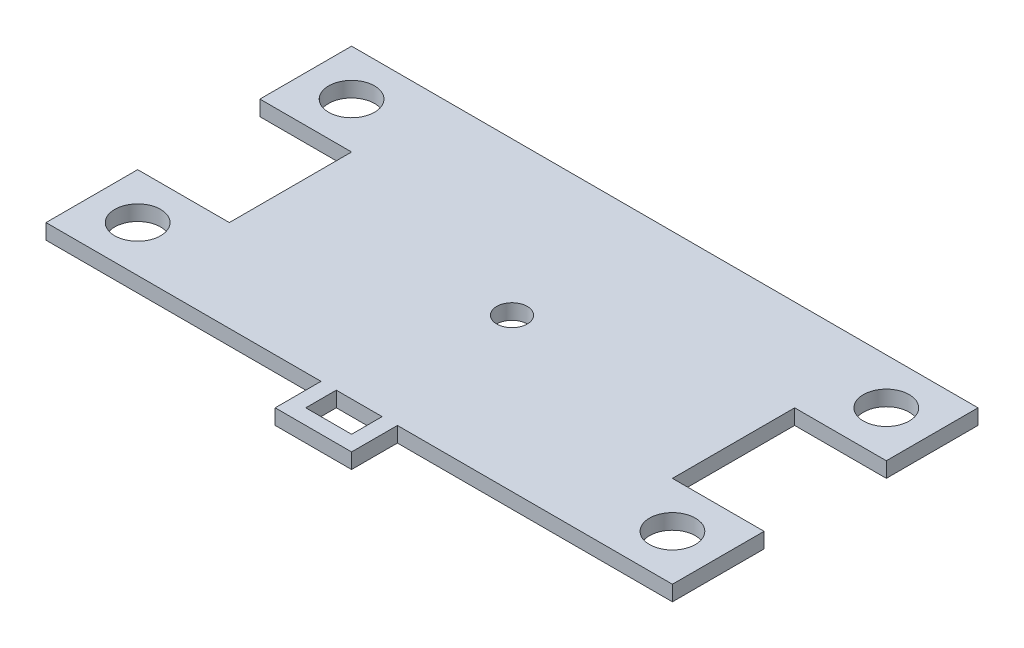
ISO-10303-21;
HEADER;
FILE_DESCRIPTION(('STEP AP214'),'2;1');
FILE_NAME('part.step','',(''),(''),'','','');
FILE_SCHEMA(('AUTOMOTIVE_DESIGN { 1 0 10303 214 1 1 1 1 }'));
ENDSEC;
DATA;
#1=APPLICATION_CONTEXT('core data for automotive mechanical design processes');
#2=APPLICATION_PROTOCOL_DEFINITION('international standard','automotive_design',2000,#1);
#3=PRODUCT_CONTEXT('',#1,'mechanical');
#4=PRODUCT('Part','Part','',(#3));
#5=PRODUCT_RELATED_PRODUCT_CATEGORY('part','',(#4));
#6=PRODUCT_DEFINITION_FORMATION('','',#4);
#7=PRODUCT_DEFINITION_CONTEXT('part definition',#1,'design');
#8=PRODUCT_DEFINITION('design','',#6,#7);
#9=PRODUCT_DEFINITION_SHAPE('','',#8);
#10=(LENGTH_UNIT() NAMED_UNIT(*) SI_UNIT(.MILLI.,.METRE.));
#11=(NAMED_UNIT(*) PLANE_ANGLE_UNIT() SI_UNIT($,.RADIAN.));
#12=(NAMED_UNIT(*) SI_UNIT($,.STERADIAN.) SOLID_ANGLE_UNIT());
#13=UNCERTAINTY_MEASURE_WITH_UNIT(LENGTH_MEASURE(1.E-05),#10,'distance_accuracy_value','');
#14=(GEOMETRIC_REPRESENTATION_CONTEXT(3) GLOBAL_UNCERTAINTY_ASSIGNED_CONTEXT((#13)) GLOBAL_UNIT_ASSIGNED_CONTEXT((#10,
#11,#12)) REPRESENTATION_CONTEXT('',''));
#15=CARTESIAN_POINT('',(0.,0.,0.));
#16=DIRECTION('',(0.,0.,1.));
#17=DIRECTION('',(1.,0.,0.));
#18=AXIS2_PLACEMENT_3D('',#15,#16,#17);
#19=CARTESIAN_POINT('',(0.,1.,0.));
#20=DIRECTION('',(0.,1.,0.));
#21=DIRECTION('',(0.,0.,1.));
#22=AXIS2_PLACEMENT_3D('',#19,#20,#21);
#23=PLANE('',#22);
#24=CARTESIAN_POINT('',(35.,1.,-14.));
#25=DIRECTION('',(0.,1.,0.));
#26=DIRECTION('',(0.,0.,1.));
#27=AXIS2_PLACEMENT_3D('',#24,#25,#26);
#28=CIRCLE('',#27,1.5);
#29=CARTESIAN_POINT('',(35.,1.,-12.5));
#30=VERTEX_POINT('',#29);
#31=EDGE_CURVE('E211',#30,#30,#28,.T.);
#32=ORIENTED_EDGE('',*,*,#31,.F.);
#33=EDGE_LOOP('',(#32));
#34=FACE_BOUND('',#33,.T.);
#35=CARTESIAN_POINT('',(0.,1.,0.));
#36=DIRECTION('',(0.,1.,0.));
#37=DIRECTION('',(0.,0.,1.));
#38=AXIS2_PLACEMENT_3D('',#35,#36,#37);
#39=CIRCLE('',#38,1.5);
#40=CARTESIAN_POINT('',(0.,1.,1.5));
#41=VERTEX_POINT('',#40);
#42=EDGE_CURVE('E223',#41,#41,#39,.T.);
#43=ORIENTED_EDGE('',*,*,#42,.F.);
#44=EDGE_LOOP('',(#43));
#45=FACE_BOUND('',#44,.T.);
#46=DIRECTION('',(0.,0.,1.));
#47=VECTOR('',#46,1.);
#48=CARTESIAN_POINT('',(-3.,1.,-17.));
#49=LINE('',#48,#47);
#50=CARTESIAN_POINT('',(-3.,1.,-17.));
#51=VERTEX_POINT('',#50);
#52=CARTESIAN_POINT('',(-3.,1.,-11.));
#53=VERTEX_POINT('',#52);
#54=EDGE_CURVE('E235',#51,#53,#49,.T.);
#55=ORIENTED_EDGE('',*,*,#54,.T.);
#56=DIRECTION('',(1.,0.,0.));
#57=VECTOR('',#56,1.);
#58=CARTESIAN_POINT('',(-3.,1.,-11.));
#59=LINE('',#58,#57);
#60=CARTESIAN_POINT('',(3.,1.,-11.));
#61=VERTEX_POINT('',#60);
#62=EDGE_CURVE('E238',#53,#61,#59,.T.);
#63=ORIENTED_EDGE('',*,*,#62,.T.);
#64=DIRECTION('',(0.,0.,1.));
#65=VECTOR('',#64,1.);
#66=CARTESIAN_POINT('',(3.,1.,-11.));
#67=LINE('',#66,#65);
#68=CARTESIAN_POINT('',(3.,1.,-3.));
#69=VERTEX_POINT('',#68);
#70=EDGE_CURVE('E241',#61,#69,#67,.T.);
#71=ORIENTED_EDGE('',*,*,#70,.T.);
#72=DIRECTION('',(-1.,0.,0.));
#73=VECTOR('',#72,1.);
#74=CARTESIAN_POINT('',(3.,1.,-3.));
#75=LINE('',#74,#73);
#76=CARTESIAN_POINT('',(-3.,1.,-3.));
#77=VERTEX_POINT('',#76);
#78=EDGE_CURVE('E243',#69,#77,#75,.T.);
#79=ORIENTED_EDGE('',*,*,#78,.T.);
#80=DIRECTION('',(0.,0.,1.));
#81=VECTOR('',#80,1.);
#82=CARTESIAN_POINT('',(-3.,1.,-3.));
#83=LINE('',#82,#81);
#84=CARTESIAN_POINT('',(-3.,1.,3.));
#85=VERTEX_POINT('',#84);
#86=EDGE_CURVE('E245',#77,#85,#83,.T.);
#87=ORIENTED_EDGE('',*,*,#86,.T.);
#88=DIRECTION('',(1.,0.,0.));
#89=VECTOR('',#88,1.);
#90=CARTESIAN_POINT('',(-3.,1.,3.));
#91=LINE('',#90,#89);
#92=CARTESIAN_POINT('',(15.,1.,3.));
#93=VERTEX_POINT('',#92);
#94=EDGE_CURVE('E247',#85,#93,#91,.T.);
#95=ORIENTED_EDGE('',*,*,#94,.T.);
#96=DIRECTION('',(0.,0.,1.));
#97=VECTOR('',#96,1.);
#98=CARTESIAN_POINT('',(15.,1.,3.));
#99=LINE('',#98,#97);
#100=CARTESIAN_POINT('',(15.,1.,6.));
#101=VERTEX_POINT('',#100);
#102=EDGE_CURVE('E249',#93,#101,#99,.T.);
#103=ORIENTED_EDGE('',*,*,#102,.T.);
#104=DIRECTION('',(1.,0.,0.));
#105=VECTOR('',#104,1.);
#106=CARTESIAN_POINT('',(15.,1.,6.));
#107=LINE('',#106,#105);
#108=CARTESIAN_POINT('',(20.,1.,5.99999999999999));
#109=VERTEX_POINT('',#108);
#110=EDGE_CURVE('E251',#101,#109,#107,.T.);
#111=ORIENTED_EDGE('',*,*,#110,.T.);
#112=DIRECTION('',(0.,0.,-1.));
#113=VECTOR('',#112,1.);
#114=CARTESIAN_POINT('',(20.,1.,3.));
#115=LINE('',#114,#113);
#116=CARTESIAN_POINT('',(20.,1.,3.));
#117=VERTEX_POINT('',#116);
#118=EDGE_CURVE('E253',#109,#117,#115,.T.);
#119=ORIENTED_EDGE('',*,*,#118,.T.);
#120=DIRECTION('',(1.,0.,0.));
#121=VECTOR('',#120,1.);
#122=CARTESIAN_POINT('',(20.,1.,3.));
#123=LINE('',#122,#121);
#124=CARTESIAN_POINT('',(38.,1.,3.00000000000001));
#125=VERTEX_POINT('',#124);
#126=EDGE_CURVE('E255',#117,#125,#123,.T.);
#127=ORIENTED_EDGE('',*,*,#126,.T.);
#128=DIRECTION('',(0.,0.,-1.));
#129=VECTOR('',#128,1.);
#130=CARTESIAN_POINT('',(38.,1.,-3.));
#131=LINE('',#130,#129);
#132=CARTESIAN_POINT('',(38.,1.,-3.));
#133=VERTEX_POINT('',#132);
#134=EDGE_CURVE('E257',#125,#133,#131,.T.);
#135=ORIENTED_EDGE('',*,*,#134,.T.);
#136=DIRECTION('',(-1.,0.,0.));
#137=VECTOR('',#136,1.);
#138=CARTESIAN_POINT('',(32.,1.,-3.));
#139=LINE('',#138,#137);
#140=CARTESIAN_POINT('',(32.,1.,-3.));
#141=VERTEX_POINT('',#140);
#142=EDGE_CURVE('E259',#133,#141,#139,.T.);
#143=ORIENTED_EDGE('',*,*,#142,.T.);
#144=DIRECTION('',(0.,0.,-1.));
#145=VECTOR('',#144,1.);
#146=CARTESIAN_POINT('',(32.,1.,-11.));
#147=LINE('',#146,#145);
#148=CARTESIAN_POINT('',(32.,1.,-11.));
#149=VERTEX_POINT('',#148);
#150=EDGE_CURVE('E261',#141,#149,#147,.T.);
#151=ORIENTED_EDGE('',*,*,#150,.T.);
#152=DIRECTION('',(1.,0.,0.));
#153=VECTOR('',#152,1.);
#154=CARTESIAN_POINT('',(38.,1.,-11.));
#155=LINE('',#154,#153);
#156=CARTESIAN_POINT('',(38.,1.,-11.));
#157=VERTEX_POINT('',#156);
#158=EDGE_CURVE('E263',#149,#157,#155,.T.);
#159=ORIENTED_EDGE('',*,*,#158,.T.);
#160=DIRECTION('',(0.,0.,-1.));
#161=VECTOR('',#160,1.);
#162=CARTESIAN_POINT('',(38.,1.,-17.));
#163=LINE('',#162,#161);
#164=CARTESIAN_POINT('',(38.,1.,-17.));
#165=VERTEX_POINT('',#164);
#166=EDGE_CURVE('E265',#157,#165,#163,.T.);
#167=ORIENTED_EDGE('',*,*,#166,.T.);
#168=DIRECTION('',(-1.,0.,0.));
#169=VECTOR('',#168,1.);
#170=CARTESIAN_POINT('',(38.,1.,-17.));
#171=LINE('',#170,#169);
#172=EDGE_CURVE('E267',#165,#51,#171,.T.);
#173=ORIENTED_EDGE('',*,*,#172,.T.);
#174=EDGE_LOOP('',(#55,#63,#71,#79,#87,#95,#103,#111,#119,#127,#135,#143,#151,#159,#167,#173));
#175=FACE_BOUND('',#174,.T.);
#176=CARTESIAN_POINT('',(0.,1.,-14.));
#177=DIRECTION('',(0.,1.,0.));
#178=DIRECTION('',(0.,0.,1.));
#179=AXIS2_PLACEMENT_3D('',#176,#177,#178);
#180=CIRCLE('',#179,1.5);
#181=CARTESIAN_POINT('',(0.,1.,-12.5));
#182=VERTEX_POINT('',#181);
#183=EDGE_CURVE('E229',#182,#182,#180,.T.);
#184=ORIENTED_EDGE('',*,*,#183,.F.);
#185=EDGE_LOOP('',(#184));
#186=FACE_BOUND('',#185,.T.);
#187=CARTESIAN_POINT('',(35.,1.,0.));
#188=DIRECTION('',(0.,1.,0.));
#189=DIRECTION('',(0.,0.,1.));
#190=AXIS2_PLACEMENT_3D('',#187,#188,#189);
#191=CIRCLE('',#190,1.5);
#192=CARTESIAN_POINT('',(35.,1.,1.5));
#193=VERTEX_POINT('',#192);
#194=EDGE_CURVE('E217',#193,#193,#191,.T.);
#195=ORIENTED_EDGE('',*,*,#194,.F.);
#196=EDGE_LOOP('',(#195));
#197=FACE_BOUND('',#196,.T.);
#198=CARTESIAN_POINT('',(17.5,1.,-7.));
#199=DIRECTION('',(0.,1.,0.));
#200=DIRECTION('',(0.,0.,1.));
#201=AXIS2_PLACEMENT_3D('',#198,#199,#200);
#202=CIRCLE('',#201,1.);
#203=CARTESIAN_POINT('',(17.5,1.,-6.));
#204=VERTEX_POINT('',#203);
#205=EDGE_CURVE('E205',#204,#204,#202,.T.);
#206=ORIENTED_EDGE('',*,*,#205,.F.);
#207=EDGE_LOOP('',(#206));
#208=FACE_BOUND('',#207,.T.);
#209=DIRECTION('',(0.,0.,1.));
#210=VECTOR('',#209,1.);
#211=CARTESIAN_POINT('',(16.,1.,3.));
#212=LINE('',#211,#210);
#213=CARTESIAN_POINT('',(16.,1.,3.));
#214=VERTEX_POINT('',#213);
#215=CARTESIAN_POINT('',(16.,1.,5.));
#216=VERTEX_POINT('',#215);
#217=EDGE_CURVE('E177',#214,#216,#212,.T.);
#218=ORIENTED_EDGE('',*,*,#217,.F.);
#219=DIRECTION('',(-1.,0.,0.));
#220=VECTOR('',#219,1.);
#221=CARTESIAN_POINT('',(16.,1.,3.));
#222=LINE('',#221,#220);
#223=CARTESIAN_POINT('',(19.,1.,3.));
#224=VERTEX_POINT('',#223);
#225=EDGE_CURVE('E169',#224,#214,#222,.T.);
#226=ORIENTED_EDGE('',*,*,#225,.F.);
#227=DIRECTION('',(0.,0.,-1.));
#228=VECTOR('',#227,1.);
#229=CARTESIAN_POINT('',(19.,1.,3.));
#230=LINE('',#229,#228);
#231=CARTESIAN_POINT('',(19.,1.,5.));
#232=VERTEX_POINT('',#231);
#233=EDGE_CURVE('E191',#232,#224,#230,.T.);
#234=ORIENTED_EDGE('',*,*,#233,.F.);
#235=DIRECTION('',(1.,0.,0.));
#236=VECTOR('',#235,1.);
#237=CARTESIAN_POINT('',(16.,1.,5.));
#238=LINE('',#237,#236);
#239=EDGE_CURVE('E189',#216,#232,#238,.T.);
#240=ORIENTED_EDGE('',*,*,#239,.F.);
#241=EDGE_LOOP('',(#218,#226,#234,#240));
#242=FACE_BOUND('',#241,.T.);
#243=ADVANCED_FACE('F32',(#34,#45,#175,#186,#197,#208,#242),#23,.T.);
#244=CARTESIAN_POINT('',(0.,0.,0.));
#245=DIRECTION('',(0.,1.,0.));
#246=DIRECTION('',(0.,0.,1.));
#247=AXIS2_PLACEMENT_3D('',#244,#245,#246);
#248=PLANE('',#247);
#249=CARTESIAN_POINT('',(17.5,0.,-7.));
#250=DIRECTION('',(0.,1.,0.));
#251=DIRECTION('',(0.,0.,1.));
#252=AXIS2_PLACEMENT_3D('',#249,#250,#251);
#253=CIRCLE('',#252,1.);
#254=CARTESIAN_POINT('',(17.5,0.,-6.));
#255=VERTEX_POINT('',#254);
#256=EDGE_CURVE('E185',#255,#255,#253,.T.);
#257=ORIENTED_EDGE('',*,*,#256,.T.);
#258=EDGE_LOOP('',(#257));
#259=FACE_BOUND('',#258,.T.);
#260=CARTESIAN_POINT('',(35.,0.,-14.));
#261=DIRECTION('',(0.,1.,0.));
#262=DIRECTION('',(0.,0.,1.));
#263=AXIS2_PLACEMENT_3D('',#260,#261,#262);
#264=CIRCLE('',#263,1.5);
#265=CARTESIAN_POINT('',(35.,0.,-12.5));
#266=VERTEX_POINT('',#265);
#267=EDGE_CURVE('E208',#266,#266,#264,.T.);
#268=ORIENTED_EDGE('',*,*,#267,.T.);
#269=EDGE_LOOP('',(#268));
#270=FACE_BOUND('',#269,.T.);
#271=CARTESIAN_POINT('',(35.,0.,0.));
#272=DIRECTION('',(0.,1.,0.));
#273=DIRECTION('',(0.,0.,1.));
#274=AXIS2_PLACEMENT_3D('',#271,#272,#273);
#275=CIRCLE('',#274,1.5);
#276=CARTESIAN_POINT('',(35.,0.,1.5));
#277=VERTEX_POINT('',#276);
#278=EDGE_CURVE('E214',#277,#277,#275,.T.);
#279=ORIENTED_EDGE('',*,*,#278,.T.);
#280=EDGE_LOOP('',(#279));
#281=FACE_BOUND('',#280,.T.);
#282=CARTESIAN_POINT('',(0.,0.,0.));
#283=DIRECTION('',(0.,1.,0.));
#284=DIRECTION('',(0.,0.,1.));
#285=AXIS2_PLACEMENT_3D('',#282,#283,#284);
#286=CIRCLE('',#285,1.5);
#287=CARTESIAN_POINT('',(0.,0.,1.5));
#288=VERTEX_POINT('',#287);
#289=EDGE_CURVE('E220',#288,#288,#286,.T.);
#290=ORIENTED_EDGE('',*,*,#289,.T.);
#291=EDGE_LOOP('',(#290));
#292=FACE_BOUND('',#291,.T.);
#293=CARTESIAN_POINT('',(0.,0.,-14.));
#294=DIRECTION('',(0.,1.,0.));
#295=DIRECTION('',(0.,0.,1.));
#296=AXIS2_PLACEMENT_3D('',#293,#294,#295);
#297=CIRCLE('',#296,1.5);
#298=CARTESIAN_POINT('',(0.,0.,-12.5));
#299=VERTEX_POINT('',#298);
#300=EDGE_CURVE('E226',#299,#299,#297,.T.);
#301=ORIENTED_EDGE('',*,*,#300,.T.);
#302=EDGE_LOOP('',(#301));
#303=FACE_BOUND('',#302,.T.);
#304=DIRECTION('',(0.,0.,1.));
#305=VECTOR('',#304,1.);
#306=CARTESIAN_POINT('',(-3.,0.,-17.));
#307=LINE('',#306,#305);
#308=CARTESIAN_POINT('',(-3.,0.,-17.));
#309=VERTEX_POINT('',#308);
#310=CARTESIAN_POINT('',(-3.,0.,-11.));
#311=VERTEX_POINT('',#310);
#312=EDGE_CURVE('E232',#309,#311,#307,.T.);
#313=ORIENTED_EDGE('',*,*,#312,.F.);
#314=DIRECTION('',(-1.,0.,0.));
#315=VECTOR('',#314,1.);
#316=CARTESIAN_POINT('',(38.,0.,-17.));
#317=LINE('',#316,#315);
#318=CARTESIAN_POINT('',(38.,0.,-17.));
#319=VERTEX_POINT('',#318);
#320=EDGE_CURVE('E239',#319,#309,#317,.T.);
#321=ORIENTED_EDGE('',*,*,#320,.F.);
#322=DIRECTION('',(0.,0.,-1.));
#323=VECTOR('',#322,1.);
#324=CARTESIAN_POINT('',(38.,0.,-17.));
#325=LINE('',#324,#323);
#326=CARTESIAN_POINT('',(38.,0.,-11.));
#327=VERTEX_POINT('',#326);
#328=EDGE_CURVE('E298',#327,#319,#325,.T.);
#329=ORIENTED_EDGE('',*,*,#328,.F.);
#330=DIRECTION('',(1.,0.,0.));
#331=VECTOR('',#330,1.);
#332=CARTESIAN_POINT('',(38.,0.,-11.));
#333=LINE('',#332,#331);
#334=CARTESIAN_POINT('',(32.,0.,-11.));
#335=VERTEX_POINT('',#334);
#336=EDGE_CURVE('E296',#335,#327,#333,.T.);
#337=ORIENTED_EDGE('',*,*,#336,.F.);
#338=DIRECTION('',(0.,0.,-1.));
#339=VECTOR('',#338,1.);
#340=CARTESIAN_POINT('',(32.,0.,-11.));
#341=LINE('',#340,#339);
#342=CARTESIAN_POINT('',(32.,0.,-3.));
#343=VERTEX_POINT('',#342);
#344=EDGE_CURVE('E294',#343,#335,#341,.T.);
#345=ORIENTED_EDGE('',*,*,#344,.F.);
#346=DIRECTION('',(-1.,0.,0.));
#347=VECTOR('',#346,1.);
#348=CARTESIAN_POINT('',(32.,0.,-3.));
#349=LINE('',#348,#347);
#350=CARTESIAN_POINT('',(38.,0.,-3.));
#351=VERTEX_POINT('',#350);
#352=EDGE_CURVE('E292',#351,#343,#349,.T.);
#353=ORIENTED_EDGE('',*,*,#352,.F.);
#354=DIRECTION('',(0.,0.,-1.));
#355=VECTOR('',#354,1.);
#356=CARTESIAN_POINT('',(38.,0.,-3.));
#357=LINE('',#356,#355);
#358=CARTESIAN_POINT('',(38.,0.,3.00000000000001));
#359=VERTEX_POINT('',#358);
#360=EDGE_CURVE('E290',#359,#351,#357,.T.);
#361=ORIENTED_EDGE('',*,*,#360,.F.);
#362=DIRECTION('',(1.,0.,0.));
#363=VECTOR('',#362,1.);
#364=CARTESIAN_POINT('',(20.,0.,3.));
#365=LINE('',#364,#363);
#366=CARTESIAN_POINT('',(20.,0.,3.));
#367=VERTEX_POINT('',#366);
#368=EDGE_CURVE('E288',#367,#359,#365,.T.);
#369=ORIENTED_EDGE('',*,*,#368,.F.);
#370=DIRECTION('',(0.,0.,-1.));
#371=VECTOR('',#370,1.);
#372=CARTESIAN_POINT('',(20.,0.,3.));
#373=LINE('',#372,#371);
#374=CARTESIAN_POINT('',(20.,0.,5.99999999999999));
#375=VERTEX_POINT('',#374);
#376=EDGE_CURVE('E286',#375,#367,#373,.T.);
#377=ORIENTED_EDGE('',*,*,#376,.F.);
#378=DIRECTION('',(1.,0.,0.));
#379=VECTOR('',#378,1.);
#380=CARTESIAN_POINT('',(15.,0.,6.));
#381=LINE('',#380,#379);
#382=CARTESIAN_POINT('',(15.,0.,6.));
#383=VERTEX_POINT('',#382);
#384=EDGE_CURVE('E284',#383,#375,#381,.T.);
#385=ORIENTED_EDGE('',*,*,#384,.F.);
#386=DIRECTION('',(0.,0.,1.));
#387=VECTOR('',#386,1.);
#388=CARTESIAN_POINT('',(15.,0.,3.));
#389=LINE('',#388,#387);
#390=CARTESIAN_POINT('',(15.,0.,3.));
#391=VERTEX_POINT('',#390);
#392=EDGE_CURVE('E282',#391,#383,#389,.T.);
#393=ORIENTED_EDGE('',*,*,#392,.F.);
#394=DIRECTION('',(1.,0.,0.));
#395=VECTOR('',#394,1.);
#396=CARTESIAN_POINT('',(-3.,0.,3.));
#397=LINE('',#396,#395);
#398=CARTESIAN_POINT('',(-3.,0.,3.));
#399=VERTEX_POINT('',#398);
#400=EDGE_CURVE('E280',#399,#391,#397,.T.);
#401=ORIENTED_EDGE('',*,*,#400,.F.);
#402=DIRECTION('',(0.,0.,1.));
#403=VECTOR('',#402,1.);
#404=CARTESIAN_POINT('',(-3.,0.,-3.));
#405=LINE('',#404,#403);
#406=CARTESIAN_POINT('',(-3.,0.,-3.));
#407=VERTEX_POINT('',#406);
#408=EDGE_CURVE('E278',#407,#399,#405,.T.);
#409=ORIENTED_EDGE('',*,*,#408,.F.);
#410=DIRECTION('',(-1.,0.,0.));
#411=VECTOR('',#410,1.);
#412=CARTESIAN_POINT('',(3.,0.,-3.));
#413=LINE('',#412,#411);
#414=CARTESIAN_POINT('',(3.,0.,-3.));
#415=VERTEX_POINT('',#414);
#416=EDGE_CURVE('E276',#415,#407,#413,.T.);
#417=ORIENTED_EDGE('',*,*,#416,.F.);
#418=DIRECTION('',(0.,0.,1.));
#419=VECTOR('',#418,1.);
#420=CARTESIAN_POINT('',(3.,0.,-11.));
#421=LINE('',#420,#419);
#422=CARTESIAN_POINT('',(3.,0.,-11.));
#423=VERTEX_POINT('',#422);
#424=EDGE_CURVE('E274',#423,#415,#421,.T.);
#425=ORIENTED_EDGE('',*,*,#424,.F.);
#426=DIRECTION('',(1.,0.,0.));
#427=VECTOR('',#426,1.);
#428=CARTESIAN_POINT('',(-3.,0.,-11.));
#429=LINE('',#428,#427);
#430=EDGE_CURVE('E272',#311,#423,#429,.T.);
#431=ORIENTED_EDGE('',*,*,#430,.F.);
#432=EDGE_LOOP('',(#313,#321,#329,#337,#345,#353,#361,#369,#377,#385,#393,#401,#409,#417,#425,#431));
#433=FACE_BOUND('',#432,.T.);
#434=DIRECTION('',(-1.,0.,0.));
#435=VECTOR('',#434,1.);
#436=CARTESIAN_POINT('',(16.,0.,3.));
#437=LINE('',#436,#435);
#438=CARTESIAN_POINT('',(19.,0.,3.));
#439=VERTEX_POINT('',#438);
#440=CARTESIAN_POINT('',(16.,0.,3.));
#441=VERTEX_POINT('',#440);
#442=EDGE_CURVE('E55',#439,#441,#437,.T.);
#443=ORIENTED_EDGE('',*,*,#442,.T.);
#444=DIRECTION('',(0.,0.,1.));
#445=VECTOR('',#444,1.);
#446=CARTESIAN_POINT('',(16.,0.,3.));
#447=LINE('',#446,#445);
#448=CARTESIAN_POINT('',(16.,0.,5.));
#449=VERTEX_POINT('',#448);
#450=EDGE_CURVE('E184',#441,#449,#447,.T.);
#451=ORIENTED_EDGE('',*,*,#450,.T.);
#452=DIRECTION('',(1.,0.,0.));
#453=VECTOR('',#452,1.);
#454=CARTESIAN_POINT('',(16.,0.,5.));
#455=LINE('',#454,#453);
#456=CARTESIAN_POINT('',(19.,0.,5.));
#457=VERTEX_POINT('',#456);
#458=EDGE_CURVE('E197',#449,#457,#455,.T.);
#459=ORIENTED_EDGE('',*,*,#458,.T.);
#460=DIRECTION('',(0.,0.,-1.));
#461=VECTOR('',#460,1.);
#462=CARTESIAN_POINT('',(19.,0.,3.));
#463=LINE('',#462,#461);
#464=EDGE_CURVE('E178',#457,#439,#463,.T.);
#465=ORIENTED_EDGE('',*,*,#464,.T.);
#466=EDGE_LOOP('',(#443,#451,#459,#465));
#467=FACE_BOUND('',#466,.T.);
#468=ADVANCED_FACE('F352',(#259,#270,#281,#292,#303,#433,#467),#248,.F.);
#469=CARTESIAN_POINT('',(-3.,1.,-17.));
#470=DIRECTION('',(1.,0.,0.));
#471=DIRECTION('',(0.,0.,-1.));
#472=AXIS2_PLACEMENT_3D('',#469,#470,#471);
#473=PLANE('',#472);
#474=ORIENTED_EDGE('',*,*,#312,.T.);
#475=DIRECTION('',(0.,-1.,0.));
#476=VECTOR('',#475,1.);
#477=CARTESIAN_POINT('',(-3.,1.,-11.));
#478=LINE('',#477,#476);
#479=EDGE_CURVE('E11',#53,#311,#478,.T.);
#480=ORIENTED_EDGE('',*,*,#479,.F.);
#481=ORIENTED_EDGE('',*,*,#54,.F.);
#482=DIRECTION('',(0.,-1.,0.));
#483=VECTOR('',#482,1.);
#484=CARTESIAN_POINT('',(-3.,1.,-17.));
#485=LINE('',#484,#483);
#486=EDGE_CURVE('E269',#51,#309,#485,.T.);
#487=ORIENTED_EDGE('',*,*,#486,.T.);
#488=EDGE_LOOP('',(#474,#480,#481,#487));
#489=FACE_BOUND('',#488,.T.);
#490=ADVANCED_FACE('F34',(#489),#473,.F.);
#491=CARTESIAN_POINT('',(-3.,1.,-11.));
#492=DIRECTION('',(0.,0.,-1.));
#493=DIRECTION('',(-1.,0.,0.));
#494=AXIS2_PLACEMENT_3D('',#491,#492,#493);
#495=PLANE('',#494);
#496=ORIENTED_EDGE('',*,*,#430,.T.);
#497=DIRECTION('',(0.,-1.,0.));
#498=VECTOR('',#497,1.);
#499=CARTESIAN_POINT('',(3.,1.,-11.));
#500=LINE('',#499,#498);
#501=EDGE_CURVE('E40',#61,#423,#500,.T.);
#502=ORIENTED_EDGE('',*,*,#501,.F.);
#503=ORIENTED_EDGE('',*,*,#62,.F.);
#504=ORIENTED_EDGE('',*,*,#479,.T.);
#505=EDGE_LOOP('',(#496,#502,#503,#504));
#506=FACE_BOUND('',#505,.T.);
#507=ADVANCED_FACE('F370',(#506),#495,.F.);
#508=CARTESIAN_POINT('',(3.,1.,-11.));
#509=DIRECTION('',(1.,0.,0.));
#510=DIRECTION('',(0.,0.,-1.));
#511=AXIS2_PLACEMENT_3D('',#508,#509,#510);
#512=PLANE('',#511);
#513=ORIENTED_EDGE('',*,*,#424,.T.);
#514=DIRECTION('',(0.,-1.,0.));
#515=VECTOR('',#514,1.);
#516=CARTESIAN_POINT('',(3.,1.,-3.));
#517=LINE('',#516,#515);
#518=EDGE_CURVE('E339',#69,#415,#517,.T.);
#519=ORIENTED_EDGE('',*,*,#518,.F.);
#520=ORIENTED_EDGE('',*,*,#70,.F.);
#521=ORIENTED_EDGE('',*,*,#501,.T.);
#522=EDGE_LOOP('',(#513,#519,#520,#521));
#523=FACE_BOUND('',#522,.T.);
#524=ADVANCED_FACE('F346',(#523),#512,.F.);
#525=CARTESIAN_POINT('',(3.,1.,-3.));
#526=DIRECTION('',(0.,0.,1.));
#527=DIRECTION('',(1.,0.,0.));
#528=AXIS2_PLACEMENT_3D('',#525,#526,#527);
#529=PLANE('',#528);
#530=ORIENTED_EDGE('',*,*,#416,.T.);
#531=DIRECTION('',(0.,-1.,0.));
#532=VECTOR('',#531,1.);
#533=CARTESIAN_POINT('',(-3.,1.,-3.));
#534=LINE('',#533,#532);
#535=EDGE_CURVE('E336',#77,#407,#534,.T.);
#536=ORIENTED_EDGE('',*,*,#535,.F.);
#537=ORIENTED_EDGE('',*,*,#78,.F.);
#538=ORIENTED_EDGE('',*,*,#518,.T.);
#539=EDGE_LOOP('',(#530,#536,#537,#538));
#540=FACE_BOUND('',#539,.T.);
#541=ADVANCED_FACE('F358',(#540),#529,.F.);
#542=CARTESIAN_POINT('',(-3.,1.,-3.));
#543=DIRECTION('',(1.,0.,0.));
#544=DIRECTION('',(0.,0.,-1.));
#545=AXIS2_PLACEMENT_3D('',#542,#543,#544);
#546=PLANE('',#545);
#547=ORIENTED_EDGE('',*,*,#408,.T.);
#548=DIRECTION('',(0.,-1.,0.));
#549=VECTOR('',#548,1.);
#550=CARTESIAN_POINT('',(-3.,1.,3.));
#551=LINE('',#550,#549);
#552=EDGE_CURVE('E333',#85,#399,#551,.T.);
#553=ORIENTED_EDGE('',*,*,#552,.F.);
#554=ORIENTED_EDGE('',*,*,#86,.F.);
#555=ORIENTED_EDGE('',*,*,#535,.T.);
#556=EDGE_LOOP('',(#547,#553,#554,#555));
#557=FACE_BOUND('',#556,.T.);
#558=ADVANCED_FACE('F362',(#557),#546,.F.);
#559=CARTESIAN_POINT('',(-3.,1.,3.));
#560=DIRECTION('',(0.,0.,-1.));
#561=DIRECTION('',(-1.,0.,0.));
#562=AXIS2_PLACEMENT_3D('',#559,#560,#561);
#563=PLANE('',#562);
#564=ORIENTED_EDGE('',*,*,#400,.T.);
#565=DIRECTION('',(0.,-1.,0.));
#566=VECTOR('',#565,1.);
#567=CARTESIAN_POINT('',(15.,1.,3.));
#568=LINE('',#567,#566);
#569=EDGE_CURVE('E330',#93,#391,#568,.T.);
#570=ORIENTED_EDGE('',*,*,#569,.F.);
#571=ORIENTED_EDGE('',*,*,#94,.F.);
#572=ORIENTED_EDGE('',*,*,#552,.T.);
#573=EDGE_LOOP('',(#564,#570,#571,#572));
#574=FACE_BOUND('',#573,.T.);
#575=ADVANCED_FACE('F423',(#574),#563,.F.);
#576=CARTESIAN_POINT('',(15.,1.,3.));
#577=DIRECTION('',(1.,0.,0.));
#578=DIRECTION('',(0.,0.,-1.));
#579=AXIS2_PLACEMENT_3D('',#576,#577,#578);
#580=PLANE('',#579);
#581=ORIENTED_EDGE('',*,*,#392,.T.);
#582=DIRECTION('',(0.,-1.,0.));
#583=VECTOR('',#582,1.);
#584=CARTESIAN_POINT('',(15.,1.,6.));
#585=LINE('',#584,#583);
#586=EDGE_CURVE('E327',#101,#383,#585,.T.);
#587=ORIENTED_EDGE('',*,*,#586,.F.);
#588=ORIENTED_EDGE('',*,*,#102,.F.);
#589=ORIENTED_EDGE('',*,*,#569,.T.);
#590=EDGE_LOOP('',(#581,#587,#588,#589));
#591=FACE_BOUND('',#590,.T.);
#592=ADVANCED_FACE('F420',(#591),#580,.F.);
#593=CARTESIAN_POINT('',(15.,1.,6.));
#594=DIRECTION('',(0.,0.,-1.));
#595=DIRECTION('',(-1.,0.,0.));
#596=AXIS2_PLACEMENT_3D('',#593,#594,#595);
#597=PLANE('',#596);
#598=ORIENTED_EDGE('',*,*,#384,.T.);
#599=DIRECTION('',(0.,-1.,0.));
#600=VECTOR('',#599,1.);
#601=CARTESIAN_POINT('',(20.,1.,5.99999999999999));
#602=LINE('',#601,#600);
#603=EDGE_CURVE('E324',#109,#375,#602,.T.);
#604=ORIENTED_EDGE('',*,*,#603,.F.);
#605=ORIENTED_EDGE('',*,*,#110,.F.);
#606=ORIENTED_EDGE('',*,*,#586,.T.);
#607=EDGE_LOOP('',(#598,#604,#605,#606));
#608=FACE_BOUND('',#607,.T.);
#609=ADVANCED_FACE('F416',(#608),#597,.F.);
#610=CARTESIAN_POINT('',(20.,1.,3.));
#611=DIRECTION('',(-1.,0.,0.));
#612=DIRECTION('',(0.,0.,1.));
#613=AXIS2_PLACEMENT_3D('',#610,#611,#612);
#614=PLANE('',#613);
#615=ORIENTED_EDGE('',*,*,#376,.T.);
#616=DIRECTION('',(0.,-1.,0.));
#617=VECTOR('',#616,1.);
#618=CARTESIAN_POINT('',(20.,1.,3.));
#619=LINE('',#618,#617);
#620=EDGE_CURVE('E321',#117,#367,#619,.T.);
#621=ORIENTED_EDGE('',*,*,#620,.F.);
#622=ORIENTED_EDGE('',*,*,#118,.F.);
#623=ORIENTED_EDGE('',*,*,#603,.T.);
#624=EDGE_LOOP('',(#615,#621,#622,#623));
#625=FACE_BOUND('',#624,.T.);
#626=ADVANCED_FACE('F412',(#625),#614,.F.);
#627=CARTESIAN_POINT('',(20.,1.,3.));
#628=DIRECTION('',(0.,0.,-1.));
#629=DIRECTION('',(-1.,0.,0.));
#630=AXIS2_PLACEMENT_3D('',#627,#628,#629);
#631=PLANE('',#630);
#632=ORIENTED_EDGE('',*,*,#368,.T.);
#633=DIRECTION('',(0.,-1.,0.));
#634=VECTOR('',#633,1.);
#635=CARTESIAN_POINT('',(38.,1.,3.00000000000001));
#636=LINE('',#635,#634);
#637=EDGE_CURVE('E318',#125,#359,#636,.T.);
#638=ORIENTED_EDGE('',*,*,#637,.F.);
#639=ORIENTED_EDGE('',*,*,#126,.F.);
#640=ORIENTED_EDGE('',*,*,#620,.T.);
#641=EDGE_LOOP('',(#632,#638,#639,#640));
#642=FACE_BOUND('',#641,.T.);
#643=ADVANCED_FACE('F407',(#642),#631,.F.);
#644=CARTESIAN_POINT('',(38.,1.,-3.));
#645=DIRECTION('',(-1.,0.,0.));
#646=DIRECTION('',(0.,0.,1.));
#647=AXIS2_PLACEMENT_3D('',#644,#645,#646);
#648=PLANE('',#647);
#649=ORIENTED_EDGE('',*,*,#360,.T.);
#650=DIRECTION('',(0.,-1.,0.));
#651=VECTOR('',#650,1.);
#652=CARTESIAN_POINT('',(38.,1.,-3.));
#653=LINE('',#652,#651);
#654=EDGE_CURVE('E315',#133,#351,#653,.T.);
#655=ORIENTED_EDGE('',*,*,#654,.F.);
#656=ORIENTED_EDGE('',*,*,#134,.F.);
#657=ORIENTED_EDGE('',*,*,#637,.T.);
#658=EDGE_LOOP('',(#649,#655,#656,#657));
#659=FACE_BOUND('',#658,.T.);
#660=ADVANCED_FACE('F401',(#659),#648,.F.);
#661=CARTESIAN_POINT('',(32.,1.,-3.));
#662=DIRECTION('',(0.,0.,1.));
#663=DIRECTION('',(1.,0.,0.));
#664=AXIS2_PLACEMENT_3D('',#661,#662,#663);
#665=PLANE('',#664);
#666=ORIENTED_EDGE('',*,*,#352,.T.);
#667=DIRECTION('',(0.,-1.,0.));
#668=VECTOR('',#667,1.);
#669=CARTESIAN_POINT('',(32.,1.,-3.));
#670=LINE('',#669,#668);
#671=EDGE_CURVE('E312',#141,#343,#670,.T.);
#672=ORIENTED_EDGE('',*,*,#671,.F.);
#673=ORIENTED_EDGE('',*,*,#142,.F.);
#674=ORIENTED_EDGE('',*,*,#654,.T.);
#675=EDGE_LOOP('',(#666,#672,#673,#674));
#676=FACE_BOUND('',#675,.T.);
#677=ADVANCED_FACE('F397',(#676),#665,.F.);
#678=CARTESIAN_POINT('',(32.,1.,-11.));
#679=DIRECTION('',(-1.,0.,0.));
#680=DIRECTION('',(0.,0.,1.));
#681=AXIS2_PLACEMENT_3D('',#678,#679,#680);
#682=PLANE('',#681);
#683=ORIENTED_EDGE('',*,*,#344,.T.);
#684=DIRECTION('',(0.,-1.,0.));
#685=VECTOR('',#684,1.);
#686=CARTESIAN_POINT('',(32.,1.,-11.));
#687=LINE('',#686,#685);
#688=EDGE_CURVE('E309',#149,#335,#687,.T.);
#689=ORIENTED_EDGE('',*,*,#688,.F.);
#690=ORIENTED_EDGE('',*,*,#150,.F.);
#691=ORIENTED_EDGE('',*,*,#671,.T.);
#692=EDGE_LOOP('',(#683,#689,#690,#691));
#693=FACE_BOUND('',#692,.T.);
#694=ADVANCED_FACE('F392',(#693),#682,.F.);
#695=CARTESIAN_POINT('',(38.,1.,-11.));
#696=DIRECTION('',(0.,0.,-1.));
#697=DIRECTION('',(-1.,0.,0.));
#698=AXIS2_PLACEMENT_3D('',#695,#696,#697);
#699=PLANE('',#698);
#700=ORIENTED_EDGE('',*,*,#336,.T.);
#701=DIRECTION('',(0.,-1.,0.));
#702=VECTOR('',#701,1.);
#703=CARTESIAN_POINT('',(38.,1.,-11.));
#704=LINE('',#703,#702);
#705=EDGE_CURVE('E306',#157,#327,#704,.T.);
#706=ORIENTED_EDGE('',*,*,#705,.F.);
#707=ORIENTED_EDGE('',*,*,#158,.F.);
#708=ORIENTED_EDGE('',*,*,#688,.T.);
#709=EDGE_LOOP('',(#700,#706,#707,#708));
#710=FACE_BOUND('',#709,.T.);
#711=ADVANCED_FACE('F386',(#710),#699,.F.);
#712=CARTESIAN_POINT('',(38.,1.,-17.));
#713=DIRECTION('',(-1.,0.,0.));
#714=DIRECTION('',(0.,0.,1.));
#715=AXIS2_PLACEMENT_3D('',#712,#713,#714);
#716=PLANE('',#715);
#717=ORIENTED_EDGE('',*,*,#328,.T.);
#718=DIRECTION('',(0.,-1.,0.));
#719=VECTOR('',#718,1.);
#720=CARTESIAN_POINT('',(38.,1.,-17.));
#721=LINE('',#720,#719);
#722=EDGE_CURVE('E303',#165,#319,#721,.T.);
#723=ORIENTED_EDGE('',*,*,#722,.F.);
#724=ORIENTED_EDGE('',*,*,#166,.F.);
#725=ORIENTED_EDGE('',*,*,#705,.T.);
#726=EDGE_LOOP('',(#717,#723,#724,#725));
#727=FACE_BOUND('',#726,.T.);
#728=ADVANCED_FACE('F382',(#727),#716,.F.);
#729=CARTESIAN_POINT('',(38.,1.,-17.));
#730=DIRECTION('',(0.,0.,1.));
#731=DIRECTION('',(1.,0.,0.));
#732=AXIS2_PLACEMENT_3D('',#729,#730,#731);
#733=PLANE('',#732);
#734=ORIENTED_EDGE('',*,*,#320,.T.);
#735=ORIENTED_EDGE('',*,*,#486,.F.);
#736=ORIENTED_EDGE('',*,*,#172,.F.);
#737=ORIENTED_EDGE('',*,*,#722,.T.);
#738=EDGE_LOOP('',(#734,#735,#736,#737));
#739=FACE_BOUND('',#738,.T.);
#740=ADVANCED_FACE('F377',(#739),#733,.F.);
#741=CARTESIAN_POINT('',(0.,1.,-14.));
#742=DIRECTION('',(0.,-1.,0.));
#743=DIRECTION('',(0.,0.,-1.));
#744=AXIS2_PLACEMENT_3D('',#741,#742,#743);
#745=CYLINDRICAL_SURFACE('',#744,1.5);
#746=ORIENTED_EDGE('',*,*,#183,.T.);
#747=EDGE_LOOP('',(#746));
#748=FACE_BOUND('',#747,.T.);
#749=ORIENTED_EDGE('',*,*,#300,.F.);
#750=EDGE_LOOP('',(#749));
#751=FACE_BOUND('',#750,.T.);
#752=ADVANCED_FACE('F443',(#748,#751),#745,.F.);
#753=CARTESIAN_POINT('',(0.,1.,0.));
#754=DIRECTION('',(0.,-1.,0.));
#755=DIRECTION('',(0.,0.,-1.));
#756=AXIS2_PLACEMENT_3D('',#753,#754,#755);
#757=CYLINDRICAL_SURFACE('',#756,1.5);
#758=ORIENTED_EDGE('',*,*,#42,.T.);
#759=EDGE_LOOP('',(#758));
#760=FACE_BOUND('',#759,.T.);
#761=ORIENTED_EDGE('',*,*,#289,.F.);
#762=EDGE_LOOP('',(#761));
#763=FACE_BOUND('',#762,.T.);
#764=ADVANCED_FACE('F505',(#760,#763),#757,.F.);
#765=CARTESIAN_POINT('',(35.,1.,0.));
#766=DIRECTION('',(0.,-1.,0.));
#767=DIRECTION('',(0.,0.,-1.));
#768=AXIS2_PLACEMENT_3D('',#765,#766,#767);
#769=CYLINDRICAL_SURFACE('',#768,1.5);
#770=ORIENTED_EDGE('',*,*,#194,.T.);
#771=EDGE_LOOP('',(#770));
#772=FACE_BOUND('',#771,.T.);
#773=ORIENTED_EDGE('',*,*,#278,.F.);
#774=EDGE_LOOP('',(#773));
#775=FACE_BOUND('',#774,.T.);
#776=ADVANCED_FACE('F512',(#772,#775),#769,.F.);
#777=CARTESIAN_POINT('',(35.,1.,-14.));
#778=DIRECTION('',(0.,-1.,0.));
#779=DIRECTION('',(0.,0.,-1.));
#780=AXIS2_PLACEMENT_3D('',#777,#778,#779);
#781=CYLINDRICAL_SURFACE('',#780,1.5);
#782=ORIENTED_EDGE('',*,*,#31,.T.);
#783=EDGE_LOOP('',(#782));
#784=FACE_BOUND('',#783,.T.);
#785=ORIENTED_EDGE('',*,*,#267,.F.);
#786=EDGE_LOOP('',(#785));
#787=FACE_BOUND('',#786,.T.);
#788=ADVANCED_FACE('F519',(#784,#787),#781,.F.);
#789=CARTESIAN_POINT('',(17.5,1.,-7.));
#790=DIRECTION('',(0.,-1.,0.));
#791=DIRECTION('',(0.,0.,-1.));
#792=AXIS2_PLACEMENT_3D('',#789,#790,#791);
#793=CYLINDRICAL_SURFACE('',#792,1.);
#794=ORIENTED_EDGE('',*,*,#205,.T.);
#795=EDGE_LOOP('',(#794));
#796=FACE_BOUND('',#795,.T.);
#797=ORIENTED_EDGE('',*,*,#256,.F.);
#798=EDGE_LOOP('',(#797));
#799=FACE_BOUND('',#798,.T.);
#800=ADVANCED_FACE('F527',(#796,#799),#793,.F.);
#801=CARTESIAN_POINT('',(16.,1.,3.));
#802=DIRECTION('',(0.,0.,1.));
#803=DIRECTION('',(1.,0.,0.));
#804=AXIS2_PLACEMENT_3D('',#801,#802,#803);
#805=PLANE('',#804);
#806=ORIENTED_EDGE('',*,*,#442,.F.);
#807=DIRECTION('',(0.,-1.,0.));
#808=VECTOR('',#807,1.);
#809=CARTESIAN_POINT('',(19.,1.,3.));
#810=LINE('',#809,#808);
#811=EDGE_CURVE('E173',#224,#439,#810,.T.);
#812=ORIENTED_EDGE('',*,*,#811,.F.);
#813=ORIENTED_EDGE('',*,*,#225,.T.);
#814=DIRECTION('',(0.,-1.,0.));
#815=VECTOR('',#814,1.);
#816=CARTESIAN_POINT('',(16.,1.,3.));
#817=LINE('',#816,#815);
#818=EDGE_CURVE('E172',#214,#441,#817,.T.);
#819=ORIENTED_EDGE('',*,*,#818,.T.);
#820=EDGE_LOOP('',(#806,#812,#813,#819));
#821=FACE_BOUND('',#820,.T.);
#822=ADVANCED_FACE('F171',(#821),#805,.T.);
#823=CARTESIAN_POINT('',(16.,1.,3.));
#824=DIRECTION('',(1.,0.,0.));
#825=DIRECTION('',(0.,0.,-1.));
#826=AXIS2_PLACEMENT_3D('',#823,#824,#825);
#827=PLANE('',#826);
#828=ORIENTED_EDGE('',*,*,#450,.F.);
#829=ORIENTED_EDGE('',*,*,#818,.F.);
#830=ORIENTED_EDGE('',*,*,#217,.T.);
#831=DIRECTION('',(0.,-1.,0.));
#832=VECTOR('',#831,1.);
#833=CARTESIAN_POINT('',(16.,1.,5.));
#834=LINE('',#833,#832);
#835=EDGE_CURVE('E186',#216,#449,#834,.T.);
#836=ORIENTED_EDGE('',*,*,#835,.T.);
#837=EDGE_LOOP('',(#828,#829,#830,#836));
#838=FACE_BOUND('',#837,.T.);
#839=ADVANCED_FACE('F181',(#838),#827,.T.);
#840=CARTESIAN_POINT('',(16.,1.,5.));
#841=DIRECTION('',(0.,0.,-1.));
#842=DIRECTION('',(-1.,0.,0.));
#843=AXIS2_PLACEMENT_3D('',#840,#841,#842);
#844=PLANE('',#843);
#845=ORIENTED_EDGE('',*,*,#458,.F.);
#846=ORIENTED_EDGE('',*,*,#835,.F.);
#847=ORIENTED_EDGE('',*,*,#239,.T.);
#848=DIRECTION('',(0.,-1.,0.));
#849=VECTOR('',#848,1.);
#850=CARTESIAN_POINT('',(19.,1.,5.));
#851=LINE('',#850,#849);
#852=EDGE_CURVE('E47',#232,#457,#851,.T.);
#853=ORIENTED_EDGE('',*,*,#852,.T.);
#854=EDGE_LOOP('',(#845,#846,#847,#853));
#855=FACE_BOUND('',#854,.T.);
#856=ADVANCED_FACE('F548',(#855),#844,.T.);
#857=CARTESIAN_POINT('',(19.,1.,3.));
#858=DIRECTION('',(-1.,0.,0.));
#859=DIRECTION('',(0.,0.,1.));
#860=AXIS2_PLACEMENT_3D('',#857,#858,#859);
#861=PLANE('',#860);
#862=ORIENTED_EDGE('',*,*,#464,.F.);
#863=ORIENTED_EDGE('',*,*,#852,.F.);
#864=ORIENTED_EDGE('',*,*,#233,.T.);
#865=ORIENTED_EDGE('',*,*,#811,.T.);
#866=EDGE_LOOP('',(#862,#863,#864,#865));
#867=FACE_BOUND('',#866,.T.);
#868=ADVANCED_FACE('F555',(#867),#861,.T.);
#869=CLOSED_SHELL('',(#243,#468,#490,#507,#524,#541,#558,#575,#592,#609,#626,#643,#660,#677,
#694,#711,#728,#740,#752,#764,#776,#788,#800,#822,#839,#856,#868));
#870=MANIFOLD_SOLID_BREP('B2',#869);
#871=ADVANCED_BREP_SHAPE_REPRESENTATION('',(#18,#870),#14);
#872=SHAPE_DEFINITION_REPRESENTATION(#9,#871);
ENDSEC;
END-ISO-10303-21;
